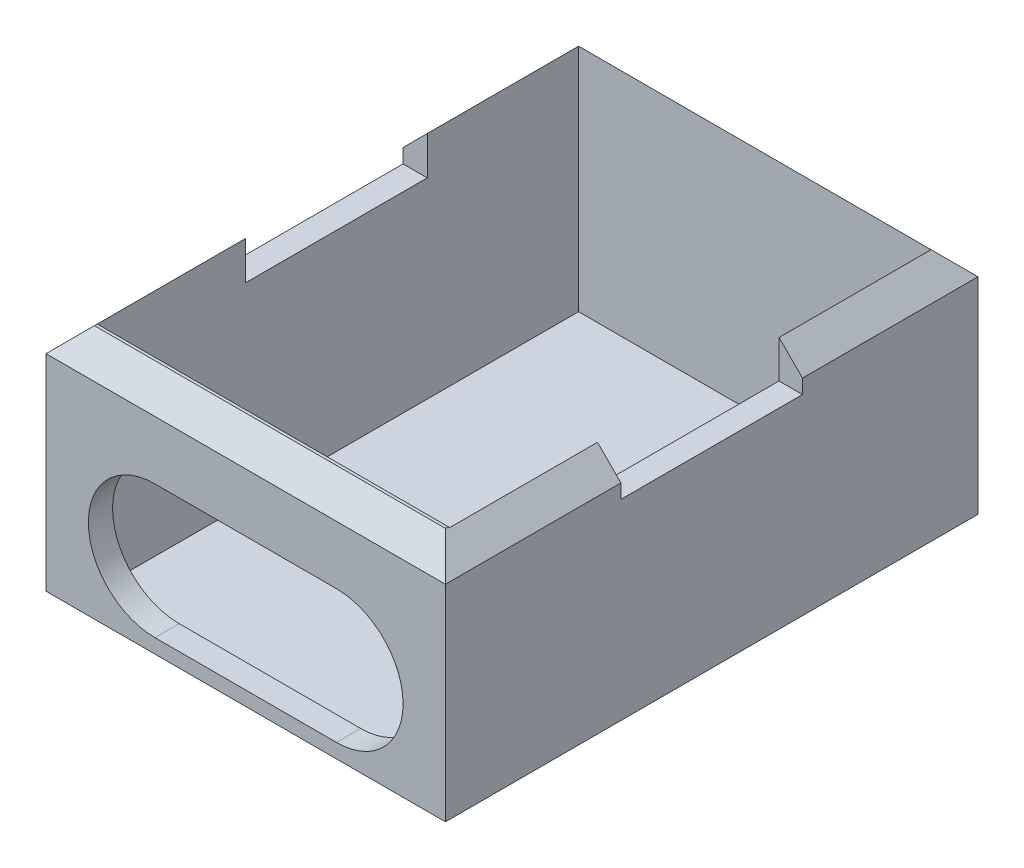
ISO-10303-21;
HEADER;
FILE_DESCRIPTION(('STEP AP214'),'2;1');
FILE_NAME('part.step','',(''),(''),'','','');
FILE_SCHEMA(('AUTOMOTIVE_DESIGN { 1 0 10303 214 1 1 1 1 }'));
ENDSEC;
DATA;
#1=APPLICATION_CONTEXT('core data for automotive mechanical design processes');
#2=APPLICATION_PROTOCOL_DEFINITION('international standard','automotive_design',2000,#1);
#3=PRODUCT_CONTEXT('',#1,'mechanical');
#4=PRODUCT('Part','Part','',(#3));
#5=PRODUCT_RELATED_PRODUCT_CATEGORY('part','',(#4));
#6=PRODUCT_DEFINITION_FORMATION('','',#4);
#7=PRODUCT_DEFINITION_CONTEXT('part definition',#1,'design');
#8=PRODUCT_DEFINITION('design','',#6,#7);
#9=PRODUCT_DEFINITION_SHAPE('','',#8);
#10=(LENGTH_UNIT() NAMED_UNIT(*) SI_UNIT(.MILLI.,.METRE.));
#11=(NAMED_UNIT(*) PLANE_ANGLE_UNIT() SI_UNIT($,.RADIAN.));
#12=(NAMED_UNIT(*) SI_UNIT($,.STERADIAN.) SOLID_ANGLE_UNIT());
#13=UNCERTAINTY_MEASURE_WITH_UNIT(LENGTH_MEASURE(1.E-05),#10,'distance_accuracy_value','');
#14=(GEOMETRIC_REPRESENTATION_CONTEXT(3) GLOBAL_UNCERTAINTY_ASSIGNED_CONTEXT((#13)) GLOBAL_UNIT_ASSIGNED_CONTEXT((#10,
#11,#12)) REPRESENTATION_CONTEXT('',''));
#15=CARTESIAN_POINT('',(0.,0.,0.));
#16=DIRECTION('',(0.,0.,1.));
#17=DIRECTION('',(1.,0.,0.));
#18=AXIS2_PLACEMENT_3D('',#15,#16,#17);
#19=CARTESIAN_POINT('',(0.,21.,0.));
#20=DIRECTION('',(0.,1.,0.));
#21=DIRECTION('',(0.,0.,1.));
#22=AXIS2_PLACEMENT_3D('',#19,#20,#21);
#23=PLANE('',#22);
#24=DIRECTION('',(1.,0.,0.));
#25=VECTOR('',#24,1.);
#26=CARTESIAN_POINT('',(2.00000000000001,21.,32.6668455440689));
#27=LINE('',#26,#25);
#28=CARTESIAN_POINT('',(2.00000000000001,21.,32.6668455440689));
#29=VERTEX_POINT('',#28);
#30=CARTESIAN_POINT('',(31.,21.,32.6668455440689));
#31=VERTEX_POINT('',#30);
#32=EDGE_CURVE('E353',#29,#31,#27,.T.);
#33=ORIENTED_EDGE('',*,*,#32,.F.);
#34=DIRECTION('',(0.,0.,1.));
#35=VECTOR('',#34,1.);
#36=CARTESIAN_POINT('',(2.00000000000004,21.,34.899591928657));
#37=LINE('',#36,#35);
#38=CARTESIAN_POINT('',(2.00000000000004,21.,32.899591928657));
#39=VERTEX_POINT('',#38);
#40=EDGE_CURVE('E69',#29,#39,#37,.T.);
#41=ORIENTED_EDGE('',*,*,#40,.T.);
#42=DIRECTION('',(1.,0.,0.));
#43=VECTOR('',#42,1.);
#44=CARTESIAN_POINT('',(33.,21.,32.899591928657));
#45=LINE('',#44,#43);
#46=CARTESIAN_POINT('',(31.,21.,32.899591928657));
#47=VERTEX_POINT('',#46);
#48=EDGE_CURVE('E73',#39,#47,#45,.T.);
#49=ORIENTED_EDGE('',*,*,#48,.T.);
#50=DIRECTION('',(0.,0.,-1.));
#51=VECTOR('',#50,1.);
#52=CARTESIAN_POINT('',(31.,21.,20.399591928657));
#53=LINE('',#52,#51);
#54=EDGE_CURVE('E504',#47,#31,#53,.T.);
#55=ORIENTED_EDGE('',*,*,#54,.T.);
#56=EDGE_LOOP('',(#33,#41,#49,#55));
#57=FACE_BOUND('',#56,.T.);
#58=ADVANCED_FACE('F50',(#57),#23,.T.);
#59=CARTESIAN_POINT('',(2.,21.,-9.100408071343));
#60=DIRECTION('',(1.,0.,0.));
#61=DIRECTION('',(0.,0.,-1.));
#62=AXIS2_PLACEMENT_3D('',#59,#60,#61);
#63=PLANE('',#62);
#64=DIRECTION('',(0.,-1.,0.));
#65=VECTOR('',#64,1.);
#66=CARTESIAN_POINT('',(2.,21.,20.399591928657));
#67=LINE('',#66,#65);
#68=CARTESIAN_POINT('',(2.,21.,20.399591928657));
#69=VERTEX_POINT('',#68);
#70=CARTESIAN_POINT('',(2.,17.825,20.399591928657));
#71=VERTEX_POINT('',#70);
#72=EDGE_CURVE('E294',#69,#71,#67,.T.);
#73=ORIENTED_EDGE('',*,*,#72,.F.);
#74=DIRECTION('',(0.,0.,1.));
#75=VECTOR('',#74,1.);
#76=CARTESIAN_POINT('',(2.,21.,-7.100408071343));
#77=LINE('',#76,#75);
#78=EDGE_CURVE('E363',#69,#29,#77,.T.);
#79=ORIENTED_EDGE('',*,*,#78,.T.);
#80=DIRECTION('',(0.,1.,0.));
#81=VECTOR('',#80,1.);
#82=CARTESIAN_POINT('',(2.00000000000001,14.,32.6668455440689));
#83=LINE('',#82,#81);
#84=CARTESIAN_POINT('',(2.,19.,32.6668455440689));
#85=VERTEX_POINT('',#84);
#86=EDGE_CURVE('E360',#85,#29,#83,.T.);
#87=ORIENTED_EDGE('',*,*,#86,.F.);
#88=DIRECTION('',(0.,0.,1.));
#89=VECTOR('',#88,1.);
#90=CARTESIAN_POINT('',(2.,19.,-9.100408071343));
#91=LINE('',#90,#89);
#92=CARTESIAN_POINT('',(2.,19.,32.899591928657));
#93=VERTEX_POINT('',#92);
#94=EDGE_CURVE('E412',#85,#93,#91,.T.);
#95=ORIENTED_EDGE('',*,*,#94,.T.);
#96=DIRECTION('',(0.,-1.,0.));
#97=VECTOR('',#96,1.);
#98=CARTESIAN_POINT('',(2.,21.,32.899591928657));
#99=LINE('',#98,#97);
#100=CARTESIAN_POINT('',(2.,2.,32.899591928657));
#101=VERTEX_POINT('',#100);
#102=EDGE_CURVE('E430',#93,#101,#99,.T.);
#103=ORIENTED_EDGE('',*,*,#102,.T.);
#104=DIRECTION('',(0.,0.,1.));
#105=VECTOR('',#104,1.);
#106=CARTESIAN_POINT('',(2.,2.,-9.100408071343));
#107=LINE('',#106,#105);
#108=CARTESIAN_POINT('',(2.,2.,-7.100408071343));
#109=VERTEX_POINT('',#108);
#110=EDGE_CURVE('E403',#109,#101,#107,.T.);
#111=ORIENTED_EDGE('',*,*,#110,.F.);
#112=DIRECTION('',(0.,-1.,0.));
#113=VECTOR('',#112,1.);
#114=CARTESIAN_POINT('',(2.,21.,-7.100408071343));
#115=LINE('',#114,#113);
#116=CARTESIAN_POINT('',(2.,21.,-7.100408071343));
#117=VERTEX_POINT('',#116);
#118=EDGE_CURVE('E437',#117,#109,#115,.T.);
#119=ORIENTED_EDGE('',*,*,#118,.F.);
#120=CARTESIAN_POINT('',(2.,21.,5.399591928657));
#121=VERTEX_POINT('',#120);
#122=EDGE_CURVE('E364',#117,#121,#77,.T.);
#123=ORIENTED_EDGE('',*,*,#122,.T.);
#124=DIRECTION('',(0.,1.,0.));
#125=VECTOR('',#124,1.);
#126=CARTESIAN_POINT('',(2.,21.,5.399591928657));
#127=LINE('',#126,#125);
#128=CARTESIAN_POINT('',(2.,17.825,5.399591928657));
#129=VERTEX_POINT('',#128);
#130=EDGE_CURVE('E285',#129,#121,#127,.T.);
#131=ORIENTED_EDGE('',*,*,#130,.F.);
#132=DIRECTION('',(0.,0.,-1.));
#133=VECTOR('',#132,1.);
#134=CARTESIAN_POINT('',(2.,17.825,-9.100408071343));
#135=LINE('',#134,#133);
#136=EDGE_CURVE('E303',#71,#129,#135,.T.);
#137=ORIENTED_EDGE('',*,*,#136,.F.);
#138=EDGE_LOOP('',(#73,#79,#87,#95,#103,#111,#119,#123,#131,#137));
#139=FACE_BOUND('',#138,.T.);
#140=ADVANCED_FACE('F561',(#139),#63,.T.);
#141=CARTESIAN_POINT('',(0.,21.,32.899591928657));
#142=DIRECTION('',(0.,0.,-1.));
#143=DIRECTION('',(-1.,0.,0.));
#144=AXIS2_PLACEMENT_3D('',#141,#142,#143);
#145=PLANE('',#144);
#146=CARTESIAN_POINT('',(9.00000000000001,8.68106576890126,32.899591928657));
#147=DIRECTION('',(0.,0.,-1.));
#148=DIRECTION('',(-1.,0.,0.));
#149=AXIS2_PLACEMENT_3D('',#146,#147,#148);
#150=CIRCLE('',#149,5.5);
#151=CARTESIAN_POINT('',(9.00000000000001,3.18106576890126,32.899591928657));
#152=VERTEX_POINT('',#151);
#153=CARTESIAN_POINT('',(9.00000000000001,14.1810657689013,32.899591928657));
#154=VERTEX_POINT('',#153);
#155=EDGE_CURVE('E345',#152,#154,#150,.T.);
#156=ORIENTED_EDGE('',*,*,#155,.F.);
#157=DIRECTION('',(1.,0.,0.));
#158=VECTOR('',#157,1.);
#159=CARTESIAN_POINT('',(0.,3.18106576890126,32.899591928657));
#160=LINE('',#159,#158);
#161=CARTESIAN_POINT('',(24.,3.18106576890126,32.899591928657));
#162=VERTEX_POINT('',#161);
#163=EDGE_CURVE('E325',#152,#162,#160,.T.);
#164=ORIENTED_EDGE('',*,*,#163,.T.);
#165=CARTESIAN_POINT('',(24.,8.68106576890126,32.899591928657));
#166=DIRECTION('',(0.,0.,-1.));
#167=DIRECTION('',(-1.,0.,0.));
#168=AXIS2_PLACEMENT_3D('',#165,#166,#167);
#169=CIRCLE('',#168,5.5);
#170=CARTESIAN_POINT('',(24.,14.1810657689013,32.899591928657));
#171=VERTEX_POINT('',#170);
#172=EDGE_CURVE('E338',#171,#162,#169,.T.);
#173=ORIENTED_EDGE('',*,*,#172,.F.);
#174=DIRECTION('',(1.,0.,0.));
#175=VECTOR('',#174,1.);
#176=CARTESIAN_POINT('',(0.,14.1810657689013,32.899591928657));
#177=LINE('',#176,#175);
#178=EDGE_CURVE('E342',#154,#171,#177,.T.);
#179=ORIENTED_EDGE('',*,*,#178,.F.);
#180=EDGE_LOOP('',(#156,#164,#173,#179));
#181=FACE_BOUND('',#180,.T.);
#182=DIRECTION('',(1.,0.,0.));
#183=VECTOR('',#182,1.);
#184=CARTESIAN_POINT('',(0.,2.,32.899591928657));
#185=LINE('',#184,#183);
#186=CARTESIAN_POINT('',(31.,2.,32.899591928657));
#187=VERTEX_POINT('',#186);
#188=EDGE_CURVE('E434',#101,#187,#185,.T.);
#189=ORIENTED_EDGE('',*,*,#188,.F.);
#190=ORIENTED_EDGE('',*,*,#102,.F.);
#191=DIRECTION('',(1.,0.,0.));
#192=VECTOR('',#191,1.);
#193=CARTESIAN_POINT('',(0.,19.,32.899591928657));
#194=LINE('',#193,#192);
#195=CARTESIAN_POINT('',(31.,19.,32.899591928657));
#196=VERTEX_POINT('',#195);
#197=EDGE_CURVE('E409',#93,#196,#194,.T.);
#198=ORIENTED_EDGE('',*,*,#197,.T.);
#199=DIRECTION('',(0.,-1.,0.));
#200=VECTOR('',#199,1.);
#201=CARTESIAN_POINT('',(31.,21.,32.899591928657));
#202=LINE('',#201,#200);
#203=EDGE_CURVE('E422',#196,#187,#202,.T.);
#204=ORIENTED_EDGE('',*,*,#203,.T.);
#205=EDGE_LOOP('',(#189,#190,#198,#204));
#206=FACE_BOUND('',#205,.T.);
#207=ADVANCED_FACE('F686',(#181,#206),#145,.T.);
#208=CARTESIAN_POINT('',(31.,21.,-9.100408071343));
#209=DIRECTION('',(-1.,0.,0.));
#210=DIRECTION('',(0.,0.,1.));
#211=AXIS2_PLACEMENT_3D('',#208,#209,#210);
#212=PLANE('',#211);
#213=DIRECTION('',(0.,1.,0.));
#214=VECTOR('',#213,1.);
#215=CARTESIAN_POINT('',(31.,21.,32.6668455440689));
#216=LINE('',#215,#214);
#217=CARTESIAN_POINT('',(31.,14.,32.6668455440689));
#218=VERTEX_POINT('',#217);
#219=CARTESIAN_POINT('',(31.,19.,32.6668455440689));
#220=VERTEX_POINT('',#219);
#221=EDGE_CURVE('E375',#218,#220,#216,.T.);
#222=ORIENTED_EDGE('',*,*,#221,.F.);
#223=DIRECTION('',(0.,0.,-1.));
#224=VECTOR('',#223,1.);
#225=CARTESIAN_POINT('',(31.,14.,-9.100408071343));
#226=LINE('',#225,#224);
#227=CARTESIAN_POINT('',(31.,14.,-7.100408071343));
#228=VERTEX_POINT('',#227);
#229=EDGE_CURVE('E385',#218,#228,#226,.T.);
#230=ORIENTED_EDGE('',*,*,#229,.T.);
#231=DIRECTION('',(0.,-1.,0.));
#232=VECTOR('',#231,1.);
#233=CARTESIAN_POINT('',(31.,21.,-7.100408071343));
#234=LINE('',#233,#232);
#235=CARTESIAN_POINT('',(31.,2.,-7.100408071343));
#236=VERTEX_POINT('',#235);
#237=EDGE_CURVE('E415',#228,#236,#234,.T.);
#238=ORIENTED_EDGE('',*,*,#237,.T.);
#239=DIRECTION('',(0.,0.,-1.));
#240=VECTOR('',#239,1.);
#241=CARTESIAN_POINT('',(31.,2.,-9.100408071343));
#242=LINE('',#241,#240);
#243=EDGE_CURVE('E426',#187,#236,#242,.T.);
#244=ORIENTED_EDGE('',*,*,#243,.F.);
#245=ORIENTED_EDGE('',*,*,#203,.F.);
#246=DIRECTION('',(0.,0.,-1.));
#247=VECTOR('',#246,1.);
#248=CARTESIAN_POINT('',(31.,19.,-9.100408071343));
#249=LINE('',#248,#247);
#250=EDGE_CURVE('E404',#196,#220,#249,.T.);
#251=ORIENTED_EDGE('',*,*,#250,.T.);
#252=EDGE_LOOP('',(#222,#230,#238,#244,#245,#251));
#253=FACE_BOUND('',#252,.T.);
#254=ADVANCED_FACE('F711',(#253),#212,.T.);
#255=CARTESIAN_POINT('',(0.,21.,-7.100408071343));
#256=DIRECTION('',(0.,0.,1.));
#257=DIRECTION('',(1.,0.,0.));
#258=AXIS2_PLACEMENT_3D('',#255,#256,#257);
#259=PLANE('',#258);
#260=DIRECTION('',(0.,1.,0.));
#261=VECTOR('',#260,1.);
#262=CARTESIAN_POINT('',(31.0620050148869,14.,-7.100408071343));
#263=LINE('',#262,#261);
#264=CARTESIAN_POINT('',(31.0620050148869,14.,-7.100408071343));
#265=VERTEX_POINT('',#264);
#266=CARTESIAN_POINT('',(31.0620050148869,20.9379949851131,-7.100408071343));
#267=VERTEX_POINT('',#266);
#268=EDGE_CURVE('E371',#265,#267,#263,.T.);
#269=ORIENTED_EDGE('',*,*,#268,.T.);
#270=DIRECTION('',(-0.707106781186546,0.707106781186549,0.));
#271=VECTOR('',#270,1.);
#272=CARTESIAN_POINT('',(15.5000000000001,36.5,-7.100408071343));
#273=LINE('',#272,#271);
#274=CARTESIAN_POINT('',(31.,21.,-7.100408071343));
#275=VERTEX_POINT('',#274);
#276=EDGE_CURVE('E498',#267,#275,#273,.T.);
#277=ORIENTED_EDGE('',*,*,#276,.T.);
#278=DIRECTION('',(-1.,0.,0.));
#279=VECTOR('',#278,1.);
#280=CARTESIAN_POINT('',(2.,21.,-7.100408071343));
#281=LINE('',#280,#279);
#282=EDGE_CURVE('E348',#275,#117,#281,.T.);
#283=ORIENTED_EDGE('',*,*,#282,.T.);
#284=ORIENTED_EDGE('',*,*,#118,.T.);
#285=DIRECTION('',(-1.,0.,0.));
#286=VECTOR('',#285,1.);
#287=CARTESIAN_POINT('',(0.,2.,-7.100408071343));
#288=LINE('',#287,#286);
#289=EDGE_CURVE('E418',#236,#109,#288,.T.);
#290=ORIENTED_EDGE('',*,*,#289,.F.);
#291=ORIENTED_EDGE('',*,*,#237,.F.);
#292=DIRECTION('',(-1.,0.,0.));
#293=VECTOR('',#292,1.);
#294=CARTESIAN_POINT('',(2.,14.,-7.100408071343));
#295=LINE('',#294,#293);
#296=EDGE_CURVE('E349',#265,#228,#295,.T.);
#297=ORIENTED_EDGE('',*,*,#296,.F.);
#298=EDGE_LOOP('',(#269,#277,#283,#284,#290,#291,#297));
#299=FACE_BOUND('',#298,.T.);
#300=ADVANCED_FACE('F715',(#299),#259,.T.);
#301=CARTESIAN_POINT('',(0.,19.,0.));
#302=DIRECTION('',(0.,1.,0.));
#303=DIRECTION('',(0.,0.,1.));
#304=AXIS2_PLACEMENT_3D('',#301,#302,#303);
#305=PLANE('',#304);
#306=ORIENTED_EDGE('',*,*,#94,.F.);
#307=DIRECTION('',(1.,0.,0.));
#308=VECTOR('',#307,1.);
#309=CARTESIAN_POINT('',(0.,19.,32.6668455440689));
#310=LINE('',#309,#308);
#311=EDGE_CURVE('E408',#85,#220,#310,.T.);
#312=ORIENTED_EDGE('',*,*,#311,.T.);
#313=ORIENTED_EDGE('',*,*,#250,.F.);
#314=ORIENTED_EDGE('',*,*,#197,.F.);
#315=EDGE_LOOP('',(#306,#312,#313,#314));
#316=FACE_BOUND('',#315,.T.);
#317=ADVANCED_FACE('F719',(#316),#305,.F.);
#318=CARTESIAN_POINT('',(0.,2.,0.));
#319=DIRECTION('',(0.,1.,0.));
#320=DIRECTION('',(0.,0.,1.));
#321=AXIS2_PLACEMENT_3D('',#318,#319,#320);
#322=PLANE('',#321);
#323=ORIENTED_EDGE('',*,*,#110,.T.);
#324=ORIENTED_EDGE('',*,*,#188,.T.);
#325=ORIENTED_EDGE('',*,*,#243,.T.);
#326=ORIENTED_EDGE('',*,*,#289,.T.);
#327=EDGE_LOOP('',(#323,#324,#325,#326));
#328=FACE_BOUND('',#327,.T.);
#329=ADVANCED_FACE('F723',(#328),#322,.T.);
#330=CARTESIAN_POINT('',(31.0620050148869,14.,32.6668455440689));
#331=DIRECTION('',(1.,0.,0.));
#332=DIRECTION('',(0.,0.,-1.));
#333=AXIS2_PLACEMENT_3D('',#330,#331,#332);
#334=PLANE('',#333);
#335=DIRECTION('',(0.,1.,0.));
#336=VECTOR('',#335,1.);
#337=CARTESIAN_POINT('',(31.0620050148869,14.,5.399591928657));
#338=LINE('',#337,#336);
#339=CARTESIAN_POINT('',(31.0620050148869,17.825,5.399591928657));
#340=VERTEX_POINT('',#339);
#341=CARTESIAN_POINT('',(31.0620050148869,20.9379949851131,5.399591928657));
#342=VERTEX_POINT('',#341);
#343=EDGE_CURVE('E281',#340,#342,#338,.T.);
#344=ORIENTED_EDGE('',*,*,#343,.T.);
#345=DIRECTION('',(0.,0.,-1.));
#346=VECTOR('',#345,1.);
#347=CARTESIAN_POINT('',(31.0620050148869,20.9379949851131,0.));
#348=LINE('',#347,#346);
#349=EDGE_CURVE('E495',#342,#267,#348,.T.);
#350=ORIENTED_EDGE('',*,*,#349,.T.);
#351=ORIENTED_EDGE('',*,*,#268,.F.);
#352=DIRECTION('',(0.,0.,-1.));
#353=VECTOR('',#352,1.);
#354=CARTESIAN_POINT('',(31.0620050148869,14.,32.6668455440689));
#355=LINE('',#354,#353);
#356=CARTESIAN_POINT('',(31.0620050148869,14.,32.6668455440689));
#357=VERTEX_POINT('',#356);
#358=EDGE_CURVE('E356',#357,#265,#355,.T.);
#359=ORIENTED_EDGE('',*,*,#358,.F.);
#360=DIRECTION('',(0.,1.,0.));
#361=VECTOR('',#360,1.);
#362=CARTESIAN_POINT('',(31.0620050148869,14.,32.6668455440689));
#363=LINE('',#362,#361);
#364=CARTESIAN_POINT('',(31.0620050148869,20.9379949851131,32.6668455440689));
#365=VERTEX_POINT('',#364);
#366=EDGE_CURVE('E376',#357,#365,#363,.T.);
#367=ORIENTED_EDGE('',*,*,#366,.T.);
#368=DIRECTION('',(0.,0.,-1.));
#369=VECTOR('',#368,1.);
#370=CARTESIAN_POINT('',(31.0620050148869,20.9379949851131,0.));
#371=LINE('',#370,#369);
#372=CARTESIAN_POINT('',(31.0620050148869,20.9379949851131,20.399591928657));
#373=VERTEX_POINT('',#372);
#374=EDGE_CURVE('E492',#365,#373,#371,.T.);
#375=ORIENTED_EDGE('',*,*,#374,.T.);
#376=DIRECTION('',(0.,-1.,0.));
#377=VECTOR('',#376,1.);
#378=CARTESIAN_POINT('',(31.0620050148869,14.,20.399591928657));
#379=LINE('',#378,#377);
#380=CARTESIAN_POINT('',(31.0620050148869,17.825,20.399591928657));
#381=VERTEX_POINT('',#380);
#382=EDGE_CURVE('E291',#373,#381,#379,.T.);
#383=ORIENTED_EDGE('',*,*,#382,.T.);
#384=DIRECTION('',(0.,0.,-1.));
#385=VECTOR('',#384,1.);
#386=CARTESIAN_POINT('',(31.0620050148869,17.825,32.6668455440689));
#387=LINE('',#386,#385);
#388=EDGE_CURVE('E256',#381,#340,#387,.T.);
#389=ORIENTED_EDGE('',*,*,#388,.T.);
#390=EDGE_LOOP('',(#344,#350,#351,#359,#367,#375,#383,#389));
#391=FACE_BOUND('',#390,.T.);
#392=ADVANCED_FACE('F727',(#391),#334,.F.);
#393=CARTESIAN_POINT('',(2.00000000000001,14.,32.6668455440689));
#394=DIRECTION('',(0.,0.,1.));
#395=DIRECTION('',(1.,0.,0.));
#396=AXIS2_PLACEMENT_3D('',#393,#394,#395);
#397=PLANE('',#396);
#398=ORIENTED_EDGE('',*,*,#32,.T.);
#399=DIRECTION('',(0.707106781186551,-0.707106781186544,0.));
#400=VECTOR('',#399,1.);
#401=CARTESIAN_POINT('',(31.,21.,32.6668455440689));
#402=LINE('',#401,#400);
#403=EDGE_CURVE('E61',#31,#365,#402,.T.);
#404=ORIENTED_EDGE('',*,*,#403,.T.);
#405=ORIENTED_EDGE('',*,*,#366,.F.);
#406=DIRECTION('',(1.,0.,0.));
#407=VECTOR('',#406,1.);
#408=CARTESIAN_POINT('',(2.00000000000001,14.,32.6668455440689));
#409=LINE('',#408,#407);
#410=EDGE_CURVE('E352',#218,#357,#409,.T.);
#411=ORIENTED_EDGE('',*,*,#410,.F.);
#412=ORIENTED_EDGE('',*,*,#221,.T.);
#413=ORIENTED_EDGE('',*,*,#311,.F.);
#414=ORIENTED_EDGE('',*,*,#86,.T.);
#415=EDGE_LOOP('',(#398,#404,#405,#411,#412,#413,#414));
#416=FACE_BOUND('',#415,.T.);
#417=ADVANCED_FACE('F554',(#416),#397,.F.);
#418=CARTESIAN_POINT('',(0.,14.,0.));
#419=DIRECTION('',(0.,1.,0.));
#420=DIRECTION('',(0.,0.,1.));
#421=AXIS2_PLACEMENT_3D('',#418,#419,#420);
#422=PLANE('',#421);
#423=ORIENTED_EDGE('',*,*,#410,.T.);
#424=ORIENTED_EDGE('',*,*,#358,.T.);
#425=ORIENTED_EDGE('',*,*,#296,.T.);
#426=ORIENTED_EDGE('',*,*,#229,.F.);
#427=EDGE_LOOP('',(#423,#424,#425,#426));
#428=FACE_BOUND('',#427,.T.);
#429=ADVANCED_FACE('F707',(#428),#422,.T.);
#430=CARTESIAN_POINT('',(0.,21.,-9.100408071343));
#431=DIRECTION('',(1.,0.,0.));
#432=DIRECTION('',(0.,0.,-1.));
#433=AXIS2_PLACEMENT_3D('',#430,#431,#432);
#434=PLANE('',#433);
#435=DIRECTION('',(0.,-1.,0.));
#436=VECTOR('',#435,1.);
#437=CARTESIAN_POINT('',(0.,21.,-9.100408071343));
#438=LINE('',#437,#436);
#439=CARTESIAN_POINT('',(0.,19.,-9.100408071343));
#440=VERTEX_POINT('',#439);
#441=CARTESIAN_POINT('',(0.,2.00000000000001,-9.100408071343));
#442=VERTEX_POINT('',#441);
#443=EDGE_CURVE('E389',#440,#442,#438,.T.);
#444=ORIENTED_EDGE('',*,*,#443,.T.);
#445=DIRECTION('',(0.,0.,1.));
#446=VECTOR('',#445,1.);
#447=CARTESIAN_POINT('',(0.,2.,-9.100408071343));
#448=LINE('',#447,#446);
#449=CARTESIAN_POINT('',(0.,2.00000000000001,34.899591928657));
#450=VERTEX_POINT('',#449);
#451=EDGE_CURVE('E486',#442,#450,#448,.T.);
#452=ORIENTED_EDGE('',*,*,#451,.T.);
#453=DIRECTION('',(0.,-1.,0.));
#454=VECTOR('',#453,1.);
#455=CARTESIAN_POINT('',(0.,21.,34.899591928657));
#456=LINE('',#455,#454);
#457=CARTESIAN_POINT('',(0.,19.,34.899591928657));
#458=VERTEX_POINT('',#457);
#459=EDGE_CURVE('E399',#458,#450,#456,.T.);
#460=ORIENTED_EDGE('',*,*,#459,.F.);
#461=DIRECTION('',(0.,0.,-1.));
#462=VECTOR('',#461,1.);
#463=CARTESIAN_POINT('',(0.,19.,20.399591928657));
#464=LINE('',#463,#462);
#465=CARTESIAN_POINT('',(0.,19.,20.399591928657));
#466=VERTEX_POINT('',#465);
#467=EDGE_CURVE('E480',#458,#466,#464,.T.);
#468=ORIENTED_EDGE('',*,*,#467,.T.);
#469=DIRECTION('',(0.,-1.,0.));
#470=VECTOR('',#469,1.);
#471=CARTESIAN_POINT('',(0.,21.,20.399591928657));
#472=LINE('',#471,#470);
#473=CARTESIAN_POINT('',(0.,17.825,20.399591928657));
#474=VERTEX_POINT('',#473);
#475=EDGE_CURVE('E288',#466,#474,#472,.T.);
#476=ORIENTED_EDGE('',*,*,#475,.T.);
#477=DIRECTION('',(0.,0.,-1.));
#478=VECTOR('',#477,1.);
#479=CARTESIAN_POINT('',(0.,17.825,-9.100408071343));
#480=LINE('',#479,#478);
#481=CARTESIAN_POINT('',(0.,17.825,5.399591928657));
#482=VERTEX_POINT('',#481);
#483=EDGE_CURVE('E297',#474,#482,#480,.T.);
#484=ORIENTED_EDGE('',*,*,#483,.T.);
#485=DIRECTION('',(0.,1.,0.));
#486=VECTOR('',#485,1.);
#487=CARTESIAN_POINT('',(0.,21.,5.399591928657));
#488=LINE('',#487,#486);
#489=CARTESIAN_POINT('',(0.,19.,5.399591928657));
#490=VERTEX_POINT('',#489);
#491=EDGE_CURVE('E277',#482,#490,#488,.T.);
#492=ORIENTED_EDGE('',*,*,#491,.T.);
#493=DIRECTION('',(0.,0.,-1.));
#494=VECTOR('',#493,1.);
#495=CARTESIAN_POINT('',(0.,19.,-9.100408071343));
#496=LINE('',#495,#494);
#497=EDGE_CURVE('E483',#490,#440,#496,.T.);
#498=ORIENTED_EDGE('',*,*,#497,.T.);
#499=EDGE_LOOP('',(#444,#452,#460,#468,#476,#484,#492,#498));
#500=FACE_BOUND('',#499,.T.);
#501=ADVANCED_FACE('F671',(#500),#434,.F.);
#502=CARTESIAN_POINT('',(0.,21.,34.899591928657));
#503=DIRECTION('',(0.,0.,-1.));
#504=DIRECTION('',(-1.,0.,0.));
#505=AXIS2_PLACEMENT_3D('',#502,#503,#504);
#506=PLANE('',#505);
#507=DIRECTION('',(-1.,0.,0.));
#508=VECTOR('',#507,1.);
#509=CARTESIAN_POINT('',(0.,3.18106576890126,34.899591928657));
#510=LINE('',#509,#508);
#511=CARTESIAN_POINT('',(24.,3.18106576890126,34.899591928657));
#512=VERTEX_POINT('',#511);
#513=CARTESIAN_POINT('',(9.00000000000001,3.18106576890126,34.899591928657));
#514=VERTEX_POINT('',#513);
#515=EDGE_CURVE('E309',#512,#514,#510,.T.);
#516=ORIENTED_EDGE('',*,*,#515,.T.);
#517=CARTESIAN_POINT('',(9.00000000000001,8.68106576890126,34.899591928657));
#518=DIRECTION('',(0.,0.,1.));
#519=DIRECTION('',(1.,0.,0.));
#520=AXIS2_PLACEMENT_3D('',#517,#518,#519);
#521=CIRCLE('',#520,5.5);
#522=CARTESIAN_POINT('',(9.00000000000001,14.1810657689013,34.899591928657));
#523=VERTEX_POINT('',#522);
#524=EDGE_CURVE('E306',#523,#514,#521,.T.);
#525=ORIENTED_EDGE('',*,*,#524,.F.);
#526=DIRECTION('',(-1.,0.,0.));
#527=VECTOR('',#526,1.);
#528=CARTESIAN_POINT('',(0.,14.1810657689013,34.899591928657));
#529=LINE('',#528,#527);
#530=CARTESIAN_POINT('',(24.,14.1810657689013,34.899591928657));
#531=VERTEX_POINT('',#530);
#532=EDGE_CURVE('E317',#531,#523,#529,.T.);
#533=ORIENTED_EDGE('',*,*,#532,.F.);
#534=CARTESIAN_POINT('',(24.,8.68106576890126,34.899591928657));
#535=DIRECTION('',(0.,0.,1.));
#536=DIRECTION('',(1.,0.,0.));
#537=AXIS2_PLACEMENT_3D('',#534,#535,#536);
#538=CIRCLE('',#537,5.5);
#539=EDGE_CURVE('E313',#512,#531,#538,.T.);
#540=ORIENTED_EDGE('',*,*,#539,.F.);
#541=EDGE_LOOP('',(#516,#525,#533,#540));
#542=FACE_BOUND('',#541,.T.);
#543=ORIENTED_EDGE('',*,*,#459,.T.);
#544=DIRECTION('',(1.,0.,0.));
#545=VECTOR('',#544,1.);
#546=CARTESIAN_POINT('',(0.,2.,34.899591928657));
#547=LINE('',#546,#545);
#548=CARTESIAN_POINT('',(33.,2.00000000000001,34.899591928657));
#549=VERTEX_POINT('',#548);
#550=EDGE_CURVE('E449',#450,#549,#547,.T.);
#551=ORIENTED_EDGE('',*,*,#550,.T.);
#552=DIRECTION('',(0.,-1.,0.));
#553=VECTOR('',#552,1.);
#554=CARTESIAN_POINT('',(33.,21.,34.899591928657));
#555=LINE('',#554,#553);
#556=CARTESIAN_POINT('',(33.,19.,34.899591928657));
#557=VERTEX_POINT('',#556);
#558=EDGE_CURVE('E396',#557,#549,#555,.T.);
#559=ORIENTED_EDGE('',*,*,#558,.F.);
#560=DIRECTION('',(-1.,0.,0.));
#561=VECTOR('',#560,1.);
#562=CARTESIAN_POINT('',(0.,19.,34.899591928657));
#563=LINE('',#562,#561);
#564=EDGE_CURVE('E446',#557,#458,#563,.T.);
#565=ORIENTED_EDGE('',*,*,#564,.T.);
#566=EDGE_LOOP('',(#543,#551,#559,#565));
#567=FACE_BOUND('',#566,.T.);
#568=ADVANCED_FACE('F702',(#542,#567),#506,.F.);
#569=CARTESIAN_POINT('',(33.,21.,-9.100408071343));
#570=DIRECTION('',(-1.,0.,0.));
#571=DIRECTION('',(0.,0.,1.));
#572=AXIS2_PLACEMENT_3D('',#569,#570,#571);
#573=PLANE('',#572);
#574=ORIENTED_EDGE('',*,*,#558,.T.);
#575=DIRECTION('',(0.,0.,-1.));
#576=VECTOR('',#575,1.);
#577=CARTESIAN_POINT('',(33.,2.,-9.100408071343));
#578=LINE('',#577,#576);
#579=CARTESIAN_POINT('',(33.,2.00000000000001,-9.100408071343));
#580=VERTEX_POINT('',#579);
#581=EDGE_CURVE('E471',#549,#580,#578,.T.);
#582=ORIENTED_EDGE('',*,*,#581,.T.);
#583=DIRECTION('',(0.,-1.,0.));
#584=VECTOR('',#583,1.);
#585=CARTESIAN_POINT('',(33.,21.,-9.100408071343));
#586=LINE('',#585,#584);
#587=CARTESIAN_POINT('',(33.,19.,-9.100408071343));
#588=VERTEX_POINT('',#587);
#589=EDGE_CURVE('E393',#588,#580,#586,.T.);
#590=ORIENTED_EDGE('',*,*,#589,.F.);
#591=DIRECTION('',(0.,0.,1.));
#592=VECTOR('',#591,1.);
#593=CARTESIAN_POINT('',(33.,19.,5.399591928657));
#594=LINE('',#593,#592);
#595=CARTESIAN_POINT('',(33.,19.,5.399591928657));
#596=VERTEX_POINT('',#595);
#597=EDGE_CURVE('E468',#588,#596,#594,.T.);
#598=ORIENTED_EDGE('',*,*,#597,.T.);
#599=DIRECTION('',(0.,1.,0.));
#600=VECTOR('',#599,1.);
#601=CARTESIAN_POINT('',(33.,21.,5.399591928657));
#602=LINE('',#601,#600);
#603=CARTESIAN_POINT('',(33.,17.825,5.399591928657));
#604=VERTEX_POINT('',#603);
#605=EDGE_CURVE('E259',#604,#596,#602,.T.);
#606=ORIENTED_EDGE('',*,*,#605,.F.);
#607=DIRECTION('',(0.,0.,-1.));
#608=VECTOR('',#607,1.);
#609=CARTESIAN_POINT('',(33.,17.825,20.399591928657));
#610=LINE('',#609,#608);
#611=CARTESIAN_POINT('',(33.,17.825,20.399591928657));
#612=VERTEX_POINT('',#611);
#613=EDGE_CURVE('E246',#612,#604,#610,.T.);
#614=ORIENTED_EDGE('',*,*,#613,.F.);
#615=DIRECTION('',(0.,-1.,0.));
#616=VECTOR('',#615,1.);
#617=CARTESIAN_POINT('',(33.,21.,20.399591928657));
#618=LINE('',#617,#616);
#619=CARTESIAN_POINT('',(33.,19.,20.399591928657));
#620=VERTEX_POINT('',#619);
#621=EDGE_CURVE('E236',#620,#612,#618,.T.);
#622=ORIENTED_EDGE('',*,*,#621,.F.);
#623=DIRECTION('',(0.,0.,1.));
#624=VECTOR('',#623,1.);
#625=CARTESIAN_POINT('',(33.,19.,34.899591928657));
#626=LINE('',#625,#624);
#627=EDGE_CURVE('E465',#620,#557,#626,.T.);
#628=ORIENTED_EDGE('',*,*,#627,.T.);
#629=EDGE_LOOP('',(#574,#582,#590,#598,#606,#614,#622,#628));
#630=FACE_BOUND('',#629,.T.);
#631=ADVANCED_FACE('F262',(#630),#573,.F.);
#632=CARTESIAN_POINT('',(0.,21.,-9.100408071343));
#633=DIRECTION('',(0.,0.,1.));
#634=DIRECTION('',(1.,0.,0.));
#635=AXIS2_PLACEMENT_3D('',#632,#633,#634);
#636=PLANE('',#635);
#637=ORIENTED_EDGE('',*,*,#589,.T.);
#638=DIRECTION('',(-1.,0.,0.));
#639=VECTOR('',#638,1.);
#640=CARTESIAN_POINT('',(0.,2.,-9.100408071343));
#641=LINE('',#640,#639);
#642=EDGE_CURVE('E477',#580,#442,#641,.T.);
#643=ORIENTED_EDGE('',*,*,#642,.T.);
#644=ORIENTED_EDGE('',*,*,#443,.F.);
#645=DIRECTION('',(1.,0.,0.));
#646=VECTOR('',#645,1.);
#647=CARTESIAN_POINT('',(33.,19.,-9.100408071343));
#648=LINE('',#647,#646);
#649=EDGE_CURVE('E474',#440,#588,#648,.T.);
#650=ORIENTED_EDGE('',*,*,#649,.T.);
#651=EDGE_LOOP('',(#637,#643,#644,#650));
#652=FACE_BOUND('',#651,.T.);
#653=ADVANCED_FACE('F695',(#652),#636,.F.);
#654=CARTESIAN_POINT('',(0.,0.,0.));
#655=DIRECTION('',(0.,1.,0.));
#656=DIRECTION('',(0.,0.,1.));
#657=AXIS2_PLACEMENT_3D('',#654,#655,#656);
#658=PLANE('',#657);
#659=DIRECTION('',(0.,0.,1.));
#660=VECTOR('',#659,1.);
#661=CARTESIAN_POINT('',(31.,0.,0.));
#662=LINE('',#661,#660);
#663=CARTESIAN_POINT('',(31.,0.,-7.10040807134299));
#664=VERTEX_POINT('',#663);
#665=CARTESIAN_POINT('',(31.,0.,32.899591928657));
#666=VERTEX_POINT('',#665);
#667=EDGE_CURVE('E458',#664,#666,#662,.T.);
#668=ORIENTED_EDGE('',*,*,#667,.T.);
#669=DIRECTION('',(-1.,0.,0.));
#670=VECTOR('',#669,1.);
#671=CARTESIAN_POINT('',(0.,0.,32.899591928657));
#672=LINE('',#671,#670);
#673=CARTESIAN_POINT('',(2.00000000000001,0.,32.899591928657));
#674=VERTEX_POINT('',#673);
#675=EDGE_CURVE('E461',#666,#674,#672,.T.);
#676=ORIENTED_EDGE('',*,*,#675,.T.);
#677=DIRECTION('',(0.,0.,-1.));
#678=VECTOR('',#677,1.);
#679=CARTESIAN_POINT('',(2.00000000000001,0.,0.));
#680=LINE('',#679,#678);
#681=CARTESIAN_POINT('',(2.00000000000001,0.,-7.10040807134299));
#682=VERTEX_POINT('',#681);
#683=EDGE_CURVE('E453',#674,#682,#680,.T.);
#684=ORIENTED_EDGE('',*,*,#683,.T.);
#685=DIRECTION('',(1.,0.,0.));
#686=VECTOR('',#685,1.);
#687=CARTESIAN_POINT('',(0.,0.,-7.10040807134299));
#688=LINE('',#687,#686);
#689=EDGE_CURVE('E455',#682,#664,#688,.T.);
#690=ORIENTED_EDGE('',*,*,#689,.T.);
#691=EDGE_LOOP('',(#668,#676,#684,#690));
#692=FACE_BOUND('',#691,.T.);
#693=ADVANCED_FACE('F691',(#692),#658,.F.);
#694=CARTESIAN_POINT('',(9.00000000000001,8.68106576890126,27.899591928657));
#695=DIRECTION('',(0.,0.,1.));
#696=DIRECTION('',(1.,0.,0.));
#697=AXIS2_PLACEMENT_3D('',#694,#695,#696);
#698=CYLINDRICAL_SURFACE('',#697,5.5);
#699=ORIENTED_EDGE('',*,*,#155,.T.);
#700=DIRECTION('',(0.,0.,1.));
#701=VECTOR('',#700,1.);
#702=CARTESIAN_POINT('',(9.00000000000001,14.1810657689013,27.899591928657));
#703=LINE('',#702,#701);
#704=EDGE_CURVE('E322',#154,#523,#703,.T.);
#705=ORIENTED_EDGE('',*,*,#704,.T.);
#706=ORIENTED_EDGE('',*,*,#524,.T.);
#707=DIRECTION('',(0.,0.,1.));
#708=VECTOR('',#707,1.);
#709=CARTESIAN_POINT('',(9.00000000000001,3.18106576890126,27.899591928657));
#710=LINE('',#709,#708);
#711=EDGE_CURVE('E321',#152,#514,#710,.T.);
#712=ORIENTED_EDGE('',*,*,#711,.F.);
#713=EDGE_LOOP('',(#699,#705,#706,#712));
#714=FACE_BOUND('',#713,.T.);
#715=ADVANCED_FACE('F694',(#714),#698,.F.);
#716=CARTESIAN_POINT('',(0.,14.1810657689013,27.899591928657));
#717=DIRECTION('',(0.,1.,0.));
#718=DIRECTION('',(-1.,0.,0.));
#719=AXIS2_PLACEMENT_3D('',#716,#717,#718);
#720=PLANE('',#719);
#721=ORIENTED_EDGE('',*,*,#178,.T.);
#722=DIRECTION('',(0.,0.,1.));
#723=VECTOR('',#722,1.);
#724=CARTESIAN_POINT('',(24.,14.1810657689013,27.899591928657));
#725=LINE('',#724,#723);
#726=EDGE_CURVE('E326',#171,#531,#725,.T.);
#727=ORIENTED_EDGE('',*,*,#726,.T.);
#728=ORIENTED_EDGE('',*,*,#532,.T.);
#729=ORIENTED_EDGE('',*,*,#704,.F.);
#730=EDGE_LOOP('',(#721,#727,#728,#729));
#731=FACE_BOUND('',#730,.T.);
#732=ADVANCED_FACE('F830',(#731),#720,.F.);
#733=CARTESIAN_POINT('',(24.,8.68106576890126,27.899591928657));
#734=DIRECTION('',(0.,0.,1.));
#735=DIRECTION('',(1.,0.,0.));
#736=AXIS2_PLACEMENT_3D('',#733,#734,#735);
#737=CYLINDRICAL_SURFACE('',#736,5.5);
#738=ORIENTED_EDGE('',*,*,#172,.T.);
#739=DIRECTION('',(0.,0.,1.));
#740=VECTOR('',#739,1.);
#741=CARTESIAN_POINT('',(24.,3.18106576890126,27.899591928657));
#742=LINE('',#741,#740);
#743=EDGE_CURVE('E329',#162,#512,#742,.T.);
#744=ORIENTED_EDGE('',*,*,#743,.T.);
#745=ORIENTED_EDGE('',*,*,#539,.T.);
#746=ORIENTED_EDGE('',*,*,#726,.F.);
#747=EDGE_LOOP('',(#738,#744,#745,#746));
#748=FACE_BOUND('',#747,.T.);
#749=ADVANCED_FACE('F825',(#748),#737,.F.);
#750=CARTESIAN_POINT('',(0.,3.18106576890126,27.899591928657));
#751=DIRECTION('',(0.,1.,0.));
#752=DIRECTION('',(0.,0.,1.));
#753=AXIS2_PLACEMENT_3D('',#750,#751,#752);
#754=PLANE('',#753);
#755=ORIENTED_EDGE('',*,*,#711,.T.);
#756=ORIENTED_EDGE('',*,*,#515,.F.);
#757=ORIENTED_EDGE('',*,*,#743,.F.);
#758=ORIENTED_EDGE('',*,*,#163,.F.);
#759=EDGE_LOOP('',(#755,#756,#757,#758));
#760=FACE_BOUND('',#759,.T.);
#761=ADVANCED_FACE('F821',(#760),#754,.T.);
#762=CARTESIAN_POINT('',(-12.,21.,5.399591928657));
#763=DIRECTION('',(0.,0.,-1.));
#764=DIRECTION('',(0.,1.,0.));
#765=AXIS2_PLACEMENT_3D('',#762,#763,#764);
#766=PLANE('',#765);
#767=ORIENTED_EDGE('',*,*,#130,.T.);
#768=DIRECTION('',(-0.707106781186546,-0.707106781186549,0.));
#769=VECTOR('',#768,1.);
#770=CARTESIAN_POINT('',(2.,21.,5.399591928657));
#771=LINE('',#770,#769);
#772=EDGE_CURVE('E501',#121,#490,#771,.T.);
#773=ORIENTED_EDGE('',*,*,#772,.T.);
#774=ORIENTED_EDGE('',*,*,#491,.F.);
#775=DIRECTION('',(1.,0.,0.));
#776=VECTOR('',#775,1.);
#777=CARTESIAN_POINT('',(-12.,17.825,5.399591928657));
#778=LINE('',#777,#776);
#779=EDGE_CURVE('E275',#482,#129,#778,.T.);
#780=ORIENTED_EDGE('',*,*,#779,.T.);
#781=EDGE_LOOP('',(#767,#773,#774,#780));
#782=FACE_BOUND('',#781,.T.);
#783=ADVANCED_FACE('F669',(#782),#766,.F.);
#784=CARTESIAN_POINT('',(-12.,21.,20.399591928657));
#785=DIRECTION('',(0.,0.,1.));
#786=DIRECTION('',(1.,0.,0.));
#787=AXIS2_PLACEMENT_3D('',#784,#785,#786);
#788=PLANE('',#787);
#789=ORIENTED_EDGE('',*,*,#475,.F.);
#790=DIRECTION('',(0.707106781186551,0.707106781186544,0.));
#791=VECTOR('',#790,1.);
#792=CARTESIAN_POINT('',(2.00000000000004,21.,20.399591928657));
#793=LINE('',#792,#791);
#794=EDGE_CURVE('E511',#466,#69,#793,.T.);
#795=ORIENTED_EDGE('',*,*,#794,.T.);
#796=ORIENTED_EDGE('',*,*,#72,.T.);
#797=DIRECTION('',(1.,0.,0.));
#798=VECTOR('',#797,1.);
#799=CARTESIAN_POINT('',(-12.,17.825,20.399591928657));
#800=LINE('',#799,#798);
#801=EDGE_CURVE('E258',#474,#71,#800,.T.);
#802=ORIENTED_EDGE('',*,*,#801,.F.);
#803=EDGE_LOOP('',(#789,#795,#796,#802));
#804=FACE_BOUND('',#803,.T.);
#805=ADVANCED_FACE('F674',(#804),#788,.F.);
#806=CARTESIAN_POINT('',(-12.,17.825,20.399591928657));
#807=DIRECTION('',(0.,-1.,0.));
#808=DIRECTION('',(0.,0.,-1.));
#809=AXIS2_PLACEMENT_3D('',#806,#807,#808);
#810=PLANE('',#809);
#811=ORIENTED_EDGE('',*,*,#136,.T.);
#812=ORIENTED_EDGE('',*,*,#779,.F.);
#813=ORIENTED_EDGE('',*,*,#483,.F.);
#814=ORIENTED_EDGE('',*,*,#801,.T.);
#815=EDGE_LOOP('',(#811,#812,#813,#814));
#816=FACE_BOUND('',#815,.T.);
#817=ADVANCED_FACE('F660',(#816),#810,.F.);
#818=EDGE_CURVE('E240',#381,#612,#800,.T.);
#819=ORIENTED_EDGE('',*,*,#818,.T.);
#820=ORIENTED_EDGE('',*,*,#613,.T.);
#821=EDGE_CURVE('E273',#340,#604,#778,.T.);
#822=ORIENTED_EDGE('',*,*,#821,.F.);
#823=ORIENTED_EDGE('',*,*,#388,.F.);
#824=EDGE_LOOP('',(#819,#820,#822,#823));
#825=FACE_BOUND('',#824,.T.);
#826=ADVANCED_FACE('F252',(#825),#810,.F.);
#827=ORIENTED_EDGE('',*,*,#382,.F.);
#828=DIRECTION('',(0.707106781186551,-0.707106781186544,0.));
#829=VECTOR('',#828,1.);
#830=CARTESIAN_POINT('',(31.,21.,20.399591928657));
#831=LINE('',#830,#829);
#832=EDGE_CURVE('E11',#373,#620,#831,.T.);
#833=ORIENTED_EDGE('',*,*,#832,.T.);
#834=ORIENTED_EDGE('',*,*,#621,.T.);
#835=ORIENTED_EDGE('',*,*,#818,.F.);
#836=EDGE_LOOP('',(#827,#833,#834,#835));
#837=FACE_BOUND('',#836,.T.);
#838=ADVANCED_FACE('F239',(#837),#788,.F.);
#839=ORIENTED_EDGE('',*,*,#605,.T.);
#840=DIRECTION('',(-0.707106781186546,0.707106781186549,0.));
#841=VECTOR('',#840,1.);
#842=CARTESIAN_POINT('',(31.,21.,5.399591928657));
#843=LINE('',#842,#841);
#844=EDGE_CURVE('E489',#596,#342,#843,.T.);
#845=ORIENTED_EDGE('',*,*,#844,.T.);
#846=ORIENTED_EDGE('',*,*,#343,.F.);
#847=ORIENTED_EDGE('',*,*,#821,.T.);
#848=EDGE_LOOP('',(#839,#845,#846,#847));
#849=FACE_BOUND('',#848,.T.);
#850=ADVANCED_FACE('F758',(#849),#766,.F.);
#851=CARTESIAN_POINT('',(0.,2.,-9.100408071343));
#852=DIRECTION('',(0.,0.707106781186549,0.707106781186546));
#853=DIRECTION('',(-1.,0.,0.));
#854=AXIS2_PLACEMENT_3D('',#851,#852,#853);
#855=PLANE('',#854);
#856=DIRECTION('',(-0.577350269189627,-0.577350269189625,0.577350269189626));
#857=VECTOR('',#856,1.);
#858=CARTESIAN_POINT('',(22.,-8.99999999999999,1.89959192865702));
#859=LINE('',#858,#857);
#860=EDGE_CURVE('E523',#664,#580,#859,.F.);
#861=ORIENTED_EDGE('',*,*,#860,.F.);
#862=ORIENTED_EDGE('',*,*,#689,.F.);
#863=DIRECTION('',(0.577350269189626,-0.577350269189625,0.577350269189626));
#864=VECTOR('',#863,1.);
#865=CARTESIAN_POINT('',(0.,2.,-9.100408071343));
#866=LINE('',#865,#864);
#867=EDGE_CURVE('E247',#442,#682,#866,.T.);
#868=ORIENTED_EDGE('',*,*,#867,.F.);
#869=ORIENTED_EDGE('',*,*,#642,.F.);
#870=EDGE_LOOP('',(#861,#862,#868,#869));
#871=FACE_BOUND('',#870,.T.);
#872=ADVANCED_FACE('F752',(#871),#855,.F.);
#873=CARTESIAN_POINT('',(0.,2.,-9.100408071343));
#874=DIRECTION('',(0.707106781186547,0.707106781186549,0.));
#875=DIRECTION('',(0.,0.,1.));
#876=AXIS2_PLACEMENT_3D('',#873,#874,#875);
#877=PLANE('',#876);
#878=ORIENTED_EDGE('',*,*,#867,.T.);
#879=ORIENTED_EDGE('',*,*,#683,.F.);
#880=DIRECTION('',(-0.577350269189626,0.577350269189625,0.577350269189627));
#881=VECTOR('',#880,1.);
#882=CARTESIAN_POINT('',(14.6666666666667,-12.6666666666667,20.2329252619903));
#883=LINE('',#882,#881);
#884=EDGE_CURVE('E519',#450,#674,#883,.F.);
#885=ORIENTED_EDGE('',*,*,#884,.F.);
#886=ORIENTED_EDGE('',*,*,#451,.F.);
#887=EDGE_LOOP('',(#878,#879,#885,#886));
#888=FACE_BOUND('',#887,.T.);
#889=ADVANCED_FACE('F745',(#888),#877,.F.);
#890=CARTESIAN_POINT('',(33.,2.,-9.100408071343));
#891=DIRECTION('',(-0.707106781186546,0.707106781186549,0.));
#892=DIRECTION('',(0.,0.,-1.));
#893=AXIS2_PLACEMENT_3D('',#890,#891,#892);
#894=PLANE('',#893);
#895=ORIENTED_EDGE('',*,*,#860,.T.);
#896=ORIENTED_EDGE('',*,*,#581,.F.);
#897=DIRECTION('',(-0.577350269189626,-0.577350269189624,-0.577350269189626));
#898=VECTOR('',#897,1.);
#899=CARTESIAN_POINT('',(18.3333333333333,-12.6666666666666,20.2329252619903));
#900=LINE('',#899,#898);
#901=EDGE_CURVE('E516',#666,#549,#900,.F.);
#902=ORIENTED_EDGE('',*,*,#901,.F.);
#903=ORIENTED_EDGE('',*,*,#667,.F.);
#904=EDGE_LOOP('',(#895,#896,#902,#903));
#905=FACE_BOUND('',#904,.T.);
#906=ADVANCED_FACE('F738',(#905),#894,.F.);
#907=CARTESIAN_POINT('',(0.,2.,34.899591928657));
#908=DIRECTION('',(0.,0.707106781186549,-0.707106781186546));
#909=DIRECTION('',(1.,0.,0.));
#910=AXIS2_PLACEMENT_3D('',#907,#908,#909);
#911=PLANE('',#910);
#912=ORIENTED_EDGE('',*,*,#884,.T.);
#913=ORIENTED_EDGE('',*,*,#675,.F.);
#914=ORIENTED_EDGE('',*,*,#901,.T.);
#915=ORIENTED_EDGE('',*,*,#550,.F.);
#916=EDGE_LOOP('',(#912,#913,#914,#915));
#917=FACE_BOUND('',#916,.T.);
#918=ADVANCED_FACE('F730',(#917),#911,.F.);
#919=CARTESIAN_POINT('',(2.,21.,0.));
#920=DIRECTION('',(-0.707106781186549,0.707106781186546,0.));
#921=DIRECTION('',(0.,0.,-1.));
#922=AXIS2_PLACEMENT_3D('',#919,#920,#921);
#923=PLANE('',#922);
#924=ORIENTED_EDGE('',*,*,#772,.F.);
#925=ORIENTED_EDGE('',*,*,#122,.F.);
#926=DIRECTION('',(-0.577350269189625,-0.577350269189627,-0.577350269189625));
#927=VECTOR('',#926,1.);
#928=CARTESIAN_POINT('',(4.36680269044766,23.3668026904477,-4.73360538089534));
#929=LINE('',#928,#927);
#930=EDGE_CURVE('E520',#440,#117,#929,.F.);
#931=ORIENTED_EDGE('',*,*,#930,.F.);
#932=ORIENTED_EDGE('',*,*,#497,.F.);
#933=EDGE_LOOP('',(#924,#925,#931,#932));
#934=FACE_BOUND('',#933,.T.);
#935=ADVANCED_FACE('F737',(#934),#923,.T.);
#936=CARTESIAN_POINT('',(0.,21.,-7.100408071343));
#937=DIRECTION('',(0.,0.707106781186546,-0.707106781186549));
#938=DIRECTION('',(1.,0.,0.));
#939=AXIS2_PLACEMENT_3D('',#936,#937,#938);
#940=PLANE('',#939);
#941=ORIENTED_EDGE('',*,*,#930,.T.);
#942=ORIENTED_EDGE('',*,*,#282,.F.);
#943=DIRECTION('',(0.577350269189625,-0.577350269189627,-0.577350269189625));
#944=VECTOR('',#943,1.);
#945=CARTESIAN_POINT('',(20.6666666666667,31.3333333333334,3.23292526199031));
#946=LINE('',#945,#944);
#947=EDGE_CURVE('E530',#588,#275,#946,.F.);
#948=ORIENTED_EDGE('',*,*,#947,.F.);
#949=ORIENTED_EDGE('',*,*,#649,.F.);
#950=EDGE_LOOP('',(#941,#942,#948,#949));
#951=FACE_BOUND('',#950,.T.);
#952=ADVANCED_FACE('F767',(#951),#940,.T.);
#953=CARTESIAN_POINT('',(31.,21.,0.));
#954=DIRECTION('',(0.707106781186549,0.707106781186546,0.));
#955=DIRECTION('',(0.,0.,1.));
#956=AXIS2_PLACEMENT_3D('',#953,#954,#955);
#957=PLANE('',#956);
#958=ORIENTED_EDGE('',*,*,#844,.F.);
#959=ORIENTED_EDGE('',*,*,#597,.F.);
#960=ORIENTED_EDGE('',*,*,#947,.T.);
#961=ORIENTED_EDGE('',*,*,#276,.F.);
#962=ORIENTED_EDGE('',*,*,#349,.F.);
#963=EDGE_LOOP('',(#958,#959,#960,#961,#962));
#964=FACE_BOUND('',#963,.T.);
#965=ADVANCED_FACE('F761',(#964),#957,.T.);
#966=CARTESIAN_POINT('',(31.,21.,0.));
#967=DIRECTION('',(0.707106781186544,0.707106781186551,0.));
#968=DIRECTION('',(0.,0.,1.));
#969=AXIS2_PLACEMENT_3D('',#966,#967,#968);
#970=PLANE('',#969);
#971=ORIENTED_EDGE('',*,*,#403,.F.);
#972=ORIENTED_EDGE('',*,*,#54,.F.);
#973=DIRECTION('',(0.577350269189628,-0.577350269189622,0.577350269189628));
#974=VECTOR('',#973,1.);
#975=CARTESIAN_POINT('',(20.0334693571142,31.9665306428856,21.9330612857712));
#976=LINE('',#975,#974);
#977=EDGE_CURVE('E55',#557,#47,#976,.F.);
#978=ORIENTED_EDGE('',*,*,#977,.F.);
#979=ORIENTED_EDGE('',*,*,#627,.F.);
#980=ORIENTED_EDGE('',*,*,#832,.F.);
#981=ORIENTED_EDGE('',*,*,#374,.F.);
#982=EDGE_LOOP('',(#971,#972,#978,#979,#980,#981));
#983=FACE_BOUND('',#982,.T.);
#984=ADVANCED_FACE('F53',(#983),#970,.T.);
#985=CARTESIAN_POINT('',(0.,21.,32.899591928657));
#986=DIRECTION('',(0.,0.707106781186551,0.707106781186544));
#987=DIRECTION('',(-1.,0.,0.));
#988=AXIS2_PLACEMENT_3D('',#985,#986,#987);
#989=PLANE('',#988);
#990=ORIENTED_EDGE('',*,*,#977,.T.);
#991=ORIENTED_EDGE('',*,*,#48,.F.);
#992=DIRECTION('',(-0.577350269189627,-0.577350269189622,0.577350269189628));
#993=VECTOR('',#992,1.);
#994=CARTESIAN_POINT('',(1.33333333333336,20.3333333333333,33.5662585953236));
#995=LINE('',#994,#993);
#996=EDGE_CURVE('E536',#458,#39,#995,.F.);
#997=ORIENTED_EDGE('',*,*,#996,.F.);
#998=ORIENTED_EDGE('',*,*,#564,.F.);
#999=EDGE_LOOP('',(#990,#991,#997,#998));
#1000=FACE_BOUND('',#999,.T.);
#1001=ADVANCED_FACE('F549',(#1000),#989,.T.);
#1002=CARTESIAN_POINT('',(2.00000000000004,21.,0.));
#1003=DIRECTION('',(-0.707106781186544,0.707106781186551,0.));
#1004=DIRECTION('',(0.,0.,-1.));
#1005=AXIS2_PLACEMENT_3D('',#1002,#1003,#1004);
#1006=PLANE('',#1005);
#1007=ORIENTED_EDGE('',*,*,#794,.F.);
#1008=ORIENTED_EDGE('',*,*,#467,.F.);
#1009=ORIENTED_EDGE('',*,*,#996,.T.);
#1010=ORIENTED_EDGE('',*,*,#40,.F.);
#1011=ORIENTED_EDGE('',*,*,#78,.F.);
#1012=EDGE_LOOP('',(#1007,#1008,#1009,#1010,#1011));
#1013=FACE_BOUND('',#1012,.T.);
#1014=ADVANCED_FACE('F675',(#1013),#1006,.T.);
#1015=CLOSED_SHELL('',(#58,#140,#207,#254,#300,#317,#329,#392,#417,#429,#501,#568,#631,#653,
#693,#715,#732,#749,#761,#783,#805,#817,#826,#838,#850,#872,#889,#906,#918,#935,#952,#965,#984,
#1001,#1014));
#1016=MANIFOLD_SOLID_BREP('B2',#1015);
#1017=ADVANCED_BREP_SHAPE_REPRESENTATION('',(#18,#1016),#14);
#1018=SHAPE_DEFINITION_REPRESENTATION(#9,#1017);
ENDSEC;
END-ISO-10303-21;
